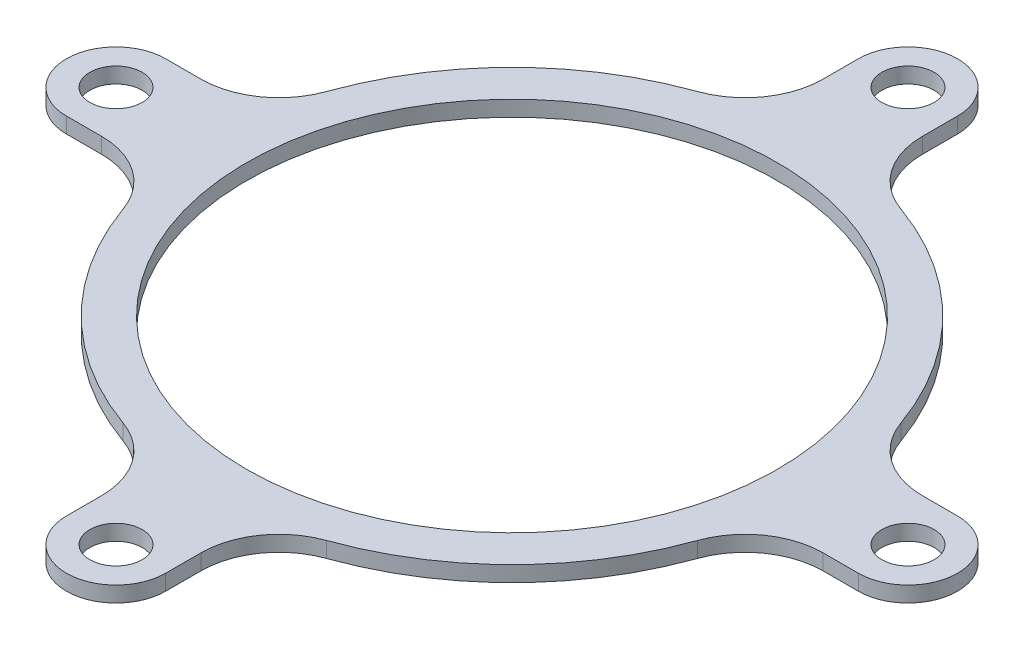
ISO-10303-21;
HEADER;
FILE_DESCRIPTION(('STEP AP214'),'2;1');
FILE_NAME('part.step','',(''),(''),'','','');
FILE_SCHEMA(('AUTOMOTIVE_DESIGN { 1 0 10303 214 1 1 1 1 }'));
ENDSEC;
DATA;
#1=APPLICATION_CONTEXT('core data for automotive mechanical design processes');
#2=APPLICATION_PROTOCOL_DEFINITION('international standard','automotive_design',2000,#1);
#3=PRODUCT_CONTEXT('',#1,'mechanical');
#4=PRODUCT('Part','Part','',(#3));
#5=PRODUCT_RELATED_PRODUCT_CATEGORY('part','',(#4));
#6=PRODUCT_DEFINITION_FORMATION('','',#4);
#7=PRODUCT_DEFINITION_CONTEXT('part definition',#1,'design');
#8=PRODUCT_DEFINITION('design','',#6,#7);
#9=PRODUCT_DEFINITION_SHAPE('','',#8);
#10=(LENGTH_UNIT() NAMED_UNIT(*) SI_UNIT(.MILLI.,.METRE.));
#11=(NAMED_UNIT(*) PLANE_ANGLE_UNIT() SI_UNIT($,.RADIAN.));
#12=(NAMED_UNIT(*) SI_UNIT($,.STERADIAN.) SOLID_ANGLE_UNIT());
#13=UNCERTAINTY_MEASURE_WITH_UNIT(LENGTH_MEASURE(1.E-05),#10,'distance_accuracy_value','');
#14=(GEOMETRIC_REPRESENTATION_CONTEXT(3) GLOBAL_UNCERTAINTY_ASSIGNED_CONTEXT((#13)) GLOBAL_UNIT_ASSIGNED_CONTEXT((#10,
#11,#12)) REPRESENTATION_CONTEXT('',''));
#15=CARTESIAN_POINT('',(0.,0.,0.));
#16=DIRECTION('',(0.,0.,1.));
#17=DIRECTION('',(1.,0.,0.));
#18=AXIS2_PLACEMENT_3D('',#15,#16,#17);
#19=CARTESIAN_POINT('',(0.,1.,0.));
#20=DIRECTION('',(0.,-1.,0.));
#21=DIRECTION('',(0.,0.,-1.));
#22=AXIS2_PLACEMENT_3D('',#19,#20,#21);
#23=CYLINDRICAL_SURFACE('',#22,39.);
#24=DIRECTION('',(0.,1.,0.));
#25=VECTOR('',#24,1.);
#26=CARTESIAN_POINT('',(36.7648599354392,-33.9979878651558,-13.0132653061228));
#27=LINE('',#26,#25);
#28=CARTESIAN_POINT('',(36.7648599354392,-1.,-13.0132653061228));
#29=VERTEX_POINT('',#28);
#30=CARTESIAN_POINT('',(36.7648599354392,1.,-13.0132653061228));
#31=VERTEX_POINT('',#30);
#32=EDGE_CURVE('E236',#29,#31,#27,.T.);
#33=ORIENTED_EDGE('',*,*,#32,.F.);
#34=CARTESIAN_POINT('',(0.,-1.,0.));
#35=DIRECTION('',(0.,1.,0.));
#36=DIRECTION('',(0.,0.,1.));
#37=AXIS2_PLACEMENT_3D('',#34,#35,#36);
#38=CIRCLE('',#37,39.);
#39=CARTESIAN_POINT('',(13.0132653061225,-1.,-36.7648599354393));
#40=VERTEX_POINT('',#39);
#41=EDGE_CURVE('E386',#29,#40,#38,.T.);
#42=ORIENTED_EDGE('',*,*,#41,.T.);
#43=DIRECTION('',(0.,1.,0.));
#44=VECTOR('',#43,1.);
#45=CARTESIAN_POINT('',(13.0132653061225,-33.9979878651557,-36.7648599354393));
#46=LINE('',#45,#44);
#47=CARTESIAN_POINT('',(13.0132653061225,1.,-36.7648599354393));
#48=VERTEX_POINT('',#47);
#49=EDGE_CURVE('E376',#40,#48,#46,.T.);
#50=ORIENTED_EDGE('',*,*,#49,.T.);
#51=CARTESIAN_POINT('',(0.,1.,0.));
#52=DIRECTION('',(0.,1.,0.));
#53=DIRECTION('',(0.,0.,1.));
#54=AXIS2_PLACEMENT_3D('',#51,#52,#53);
#55=CIRCLE('',#54,39.);
#56=EDGE_CURVE('E47',#31,#48,#55,.T.);
#57=ORIENTED_EDGE('',*,*,#56,.F.);
#58=EDGE_LOOP('',(#33,#42,#50,#57));
#59=FACE_BOUND('',#58,.T.);
#60=ADVANCED_FACE('F37',(#59),#23,.T.);
#61=CARTESIAN_POINT('',(13.0132653061224,-1.,36.7648599354393));
#62=VERTEX_POINT('',#61);
#63=CARTESIAN_POINT('',(36.7648599354394,-1.,13.0132653061221));
#64=VERTEX_POINT('',#63);
#65=EDGE_CURVE('E444',#62,#64,#38,.T.);
#66=ORIENTED_EDGE('',*,*,#65,.T.);
#67=DIRECTION('',(0.,1.,0.));
#68=VECTOR('',#67,1.);
#69=CARTESIAN_POINT('',(36.7648599354394,-33.9979878651558,13.0132653061221));
#70=LINE('',#69,#68);
#71=CARTESIAN_POINT('',(36.7648599354394,1.,13.0132653061221));
#72=VERTEX_POINT('',#71);
#73=EDGE_CURVE('E61',#64,#72,#70,.T.);
#74=ORIENTED_EDGE('',*,*,#73,.T.);
#75=CARTESIAN_POINT('',(13.0132653061225,1.,36.7648599354393));
#76=VERTEX_POINT('',#75);
#77=EDGE_CURVE('E224',#76,#72,#55,.T.);
#78=ORIENTED_EDGE('',*,*,#77,.F.);
#79=DIRECTION('',(0.,1.,0.));
#80=VECTOR('',#79,1.);
#81=CARTESIAN_POINT('',(13.0132653061224,-33.9979878651557,36.7648599354393));
#82=LINE('',#81,#80);
#83=EDGE_CURVE('E278',#62,#76,#82,.T.);
#84=ORIENTED_EDGE('',*,*,#83,.F.);
#85=EDGE_LOOP('',(#66,#74,#78,#84));
#86=FACE_BOUND('',#85,.T.);
#87=ADVANCED_FACE('F410',(#86),#23,.T.);
#88=CARTESIAN_POINT('',(-36.7648599354393,-1.,13.0132653061226));
#89=VERTEX_POINT('',#88);
#90=CARTESIAN_POINT('',(-13.0132653061225,-1.,36.7648599354393));
#91=VERTEX_POINT('',#90);
#92=EDGE_CURVE('E440',#89,#91,#38,.T.);
#93=ORIENTED_EDGE('',*,*,#92,.T.);
#94=DIRECTION('',(0.,1.,0.));
#95=VECTOR('',#94,1.);
#96=CARTESIAN_POINT('',(-13.0132653061225,-33.9979878651557,36.7648599354393));
#97=LINE('',#96,#95);
#98=CARTESIAN_POINT('',(-13.0132653061225,1.,36.7648599354393));
#99=VERTEX_POINT('',#98);
#100=EDGE_CURVE('E286',#91,#99,#97,.T.);
#101=ORIENTED_EDGE('',*,*,#100,.T.);
#102=CARTESIAN_POINT('',(-36.7648599354393,1.,13.0132653061226));
#103=VERTEX_POINT('',#102);
#104=EDGE_CURVE('E46',#103,#99,#55,.T.);
#105=ORIENTED_EDGE('',*,*,#104,.F.);
#106=DIRECTION('',(0.,1.,0.));
#107=VECTOR('',#106,1.);
#108=CARTESIAN_POINT('',(-36.7648599354392,-33.9979878651558,13.0132653061226));
#109=LINE('',#108,#107);
#110=EDGE_CURVE('E323',#89,#103,#109,.T.);
#111=ORIENTED_EDGE('',*,*,#110,.F.);
#112=EDGE_LOOP('',(#93,#101,#105,#111));
#113=FACE_BOUND('',#112,.T.);
#114=ADVANCED_FACE('F406',(#113),#23,.T.);
#115=CARTESIAN_POINT('',(0.,1.,0.));
#116=DIRECTION('',(0.,1.,0.));
#117=DIRECTION('',(0.,0.,1.));
#118=AXIS2_PLACEMENT_3D('',#115,#116,#117);
#119=PLANE('',#118);
#120=CARTESIAN_POINT('',(-13.0132653061225,1.,-36.7648599354393));
#121=VERTEX_POINT('',#120);
#122=CARTESIAN_POINT('',(-36.7648599354393,1.,-13.0132653061223));
#123=VERTEX_POINT('',#122);
#124=EDGE_CURVE('E11',#121,#123,#55,.T.);
#125=ORIENTED_EDGE('',*,*,#124,.T.);
#126=CARTESIAN_POINT('',(-46.1917470983725,1.,-16.3499999999998));
#127=DIRECTION('',(0.,-1.,0.));
#128=DIRECTION('',(1.,0.,0.));
#129=AXIS2_PLACEMENT_3D('',#126,#127,#128);
#130=CIRCLE('',#129,10.);
#131=CARTESIAN_POINT('',(-46.1917470983725,1.,-6.34999999999984));
#132=VERTEX_POINT('',#131);
#133=EDGE_CURVE('E311',#123,#132,#130,.T.);
#134=ORIENTED_EDGE('',*,*,#133,.T.);
#135=DIRECTION('',(-1.,0.,0.));
#136=VECTOR('',#135,1.);
#137=CARTESIAN_POINT('',(-50.7,1.,-6.34999999999982));
#138=LINE('',#137,#136);
#139=CARTESIAN_POINT('',(-50.7,1.,-6.34999999999982));
#140=VERTEX_POINT('',#139);
#141=EDGE_CURVE('E314',#132,#140,#138,.T.);
#142=ORIENTED_EDGE('',*,*,#141,.T.);
#143=CARTESIAN_POINT('',(-50.7,1.,1.77018103879347E-13));
#144=DIRECTION('',(0.,1.,0.));
#145=DIRECTION('',(-1.,0.,0.));
#146=AXIS2_PLACEMENT_3D('',#143,#144,#145);
#147=CIRCLE('',#146,6.35);
#148=CARTESIAN_POINT('',(-50.7,1.,6.35000000000018));
#149=VERTEX_POINT('',#148);
#150=EDGE_CURVE('E317',#140,#149,#147,.T.);
#151=ORIENTED_EDGE('',*,*,#150,.T.);
#152=DIRECTION('',(1.,0.,0.));
#153=VECTOR('',#152,1.);
#154=CARTESIAN_POINT('',(-46.1917470983724,1.,6.35000000000016));
#155=LINE('',#154,#153);
#156=CARTESIAN_POINT('',(-46.1917470983724,1.,6.35000000000016));
#157=VERTEX_POINT('',#156);
#158=EDGE_CURVE('E320',#149,#157,#155,.T.);
#159=ORIENTED_EDGE('',*,*,#158,.T.);
#160=CARTESIAN_POINT('',(-46.1917470983724,1.,16.3500000000002));
#161=DIRECTION('',(0.,-1.,0.));
#162=DIRECTION('',(-1.,0.,0.));
#163=AXIS2_PLACEMENT_3D('',#160,#161,#162);
#164=CIRCLE('',#163,10.);
#165=EDGE_CURVE('E308',#157,#103,#164,.T.);
#166=ORIENTED_EDGE('',*,*,#165,.T.);
#167=ORIENTED_EDGE('',*,*,#104,.T.);
#168=CARTESIAN_POINT('',(-16.35,1.,46.1917470983725));
#169=DIRECTION('',(0.,-1.,0.));
#170=DIRECTION('',(0.,0.,-1.));
#171=AXIS2_PLACEMENT_3D('',#168,#169,#170);
#172=CIRCLE('',#171,10.);
#173=CARTESIAN_POINT('',(-6.35,1.,46.1917470983725));
#174=VERTEX_POINT('',#173);
#175=EDGE_CURVE('E266',#99,#174,#172,.T.);
#176=ORIENTED_EDGE('',*,*,#175,.T.);
#177=DIRECTION('',(0.,0.,1.));
#178=VECTOR('',#177,1.);
#179=CARTESIAN_POINT('',(-6.35,1.,50.7));
#180=LINE('',#179,#178);
#181=CARTESIAN_POINT('',(-6.35,1.,50.7));
#182=VERTEX_POINT('',#181);
#183=EDGE_CURVE('E269',#174,#182,#180,.T.);
#184=ORIENTED_EDGE('',*,*,#183,.T.);
#185=CARTESIAN_POINT('',(0.,1.,50.7));
#186=DIRECTION('',(0.,1.,0.));
#187=DIRECTION('',(0.,0.,1.));
#188=AXIS2_PLACEMENT_3D('',#185,#186,#187);
#189=CIRCLE('',#188,6.35);
#190=CARTESIAN_POINT('',(6.35,1.,50.7));
#191=VERTEX_POINT('',#190);
#192=EDGE_CURVE('E272',#182,#191,#189,.T.);
#193=ORIENTED_EDGE('',*,*,#192,.T.);
#194=DIRECTION('',(0.,0.,-1.));
#195=VECTOR('',#194,1.);
#196=CARTESIAN_POINT('',(6.35,1.,46.1917470983725));
#197=LINE('',#196,#195);
#198=CARTESIAN_POINT('',(6.35,1.,46.1917470983725));
#199=VERTEX_POINT('',#198);
#200=EDGE_CURVE('E275',#191,#199,#197,.T.);
#201=ORIENTED_EDGE('',*,*,#200,.T.);
#202=CARTESIAN_POINT('',(16.35,1.,46.1917470983725));
#203=DIRECTION('',(0.,-1.,0.));
#204=DIRECTION('',(0.,0.,1.));
#205=AXIS2_PLACEMENT_3D('',#202,#203,#204);
#206=CIRCLE('',#205,10.);
#207=EDGE_CURVE('E264',#199,#76,#206,.T.);
#208=ORIENTED_EDGE('',*,*,#207,.T.);
#209=ORIENTED_EDGE('',*,*,#77,.T.);
#210=CARTESIAN_POINT('',(46.1917470983726,1.,16.3499999999995));
#211=DIRECTION('',(0.,-1.,0.));
#212=DIRECTION('',(-1.,0.,0.));
#213=AXIS2_PLACEMENT_3D('',#210,#211,#212);
#214=CIRCLE('',#213,10.);
#215=CARTESIAN_POINT('',(46.1917470983725,1.,6.34999999999952));
#216=VERTEX_POINT('',#215);
#217=EDGE_CURVE('E205',#72,#216,#214,.T.);
#218=ORIENTED_EDGE('',*,*,#217,.T.);
#219=DIRECTION('',(1.,0.,0.));
#220=VECTOR('',#219,1.);
#221=CARTESIAN_POINT('',(50.7000000000001,1.,6.34999999999947));
#222=LINE('',#221,#220);
#223=CARTESIAN_POINT('',(50.7000000000001,1.,6.34999999999947));
#224=VERTEX_POINT('',#223);
#225=EDGE_CURVE('E213',#216,#224,#222,.T.);
#226=ORIENTED_EDGE('',*,*,#225,.T.);
#227=CARTESIAN_POINT('',(50.7,1.,-5.31054311638041E-13));
#228=DIRECTION('',(0.,1.,0.));
#229=DIRECTION('',(1.,0.,0.));
#230=AXIS2_PLACEMENT_3D('',#227,#228,#229);
#231=CIRCLE('',#230,6.35);
#232=CARTESIAN_POINT('',(50.6999999999999,1.,-6.35000000000053));
#233=VERTEX_POINT('',#232);
#234=EDGE_CURVE('E219',#224,#233,#231,.T.);
#235=ORIENTED_EDGE('',*,*,#234,.T.);
#236=DIRECTION('',(-1.,0.,0.));
#237=VECTOR('',#236,1.);
#238=CARTESIAN_POINT('',(46.1917470983724,1.,-6.35000000000048));
#239=LINE('',#238,#237);
#240=CARTESIAN_POINT('',(46.1917470983724,1.,-6.35000000000048));
#241=VERTEX_POINT('',#240);
#242=EDGE_CURVE('E233',#233,#241,#239,.T.);
#243=ORIENTED_EDGE('',*,*,#242,.T.);
#244=CARTESIAN_POINT('',(46.1917470983723,1.,-16.3500000000005));
#245=DIRECTION('',(0.,-1.,0.));
#246=DIRECTION('',(1.,0.,0.));
#247=AXIS2_PLACEMENT_3D('',#244,#245,#246);
#248=CIRCLE('',#247,10.);
#249=EDGE_CURVE('E225',#241,#31,#248,.T.);
#250=ORIENTED_EDGE('',*,*,#249,.T.);
#251=ORIENTED_EDGE('',*,*,#56,.T.);
#252=CARTESIAN_POINT('',(16.35,1.,-46.1917470983725));
#253=DIRECTION('',(0.,-1.,0.));
#254=DIRECTION('',(0.,0.,1.));
#255=AXIS2_PLACEMENT_3D('',#252,#253,#254);
#256=CIRCLE('',#255,10.);
#257=CARTESIAN_POINT('',(6.35,1.,-46.1917470983725));
#258=VERTEX_POINT('',#257);
#259=EDGE_CURVE('E356',#48,#258,#256,.T.);
#260=ORIENTED_EDGE('',*,*,#259,.T.);
#261=DIRECTION('',(0.,0.,-1.));
#262=VECTOR('',#261,1.);
#263=CARTESIAN_POINT('',(6.35,1.,-50.7));
#264=LINE('',#263,#262);
#265=CARTESIAN_POINT('',(6.35,1.,-50.7));
#266=VERTEX_POINT('',#265);
#267=EDGE_CURVE('E359',#258,#266,#264,.T.);
#268=ORIENTED_EDGE('',*,*,#267,.T.);
#269=CARTESIAN_POINT('',(0.,1.,-50.7));
#270=DIRECTION('',(0.,1.,0.));
#271=DIRECTION('',(0.,0.,-1.));
#272=AXIS2_PLACEMENT_3D('',#269,#270,#271);
#273=CIRCLE('',#272,6.35);
#274=CARTESIAN_POINT('',(-6.35,1.,-50.7));
#275=VERTEX_POINT('',#274);
#276=EDGE_CURVE('E362',#266,#275,#273,.T.);
#277=ORIENTED_EDGE('',*,*,#276,.T.);
#278=DIRECTION('',(0.,0.,1.));
#279=VECTOR('',#278,1.);
#280=CARTESIAN_POINT('',(-6.35,1.,-46.1917470983725));
#281=LINE('',#280,#279);
#282=CARTESIAN_POINT('',(-6.35,1.,-46.1917470983725));
#283=VERTEX_POINT('',#282);
#284=EDGE_CURVE('E365',#275,#283,#281,.T.);
#285=ORIENTED_EDGE('',*,*,#284,.T.);
#286=CARTESIAN_POINT('',(-16.35,1.,-46.1917470983725));
#287=DIRECTION('',(0.,-1.,0.));
#288=DIRECTION('',(0.,0.,-1.));
#289=AXIS2_PLACEMENT_3D('',#286,#287,#288);
#290=CIRCLE('',#289,10.);
#291=EDGE_CURVE('E353',#283,#121,#290,.T.);
#292=ORIENTED_EDGE('',*,*,#291,.T.);
#293=EDGE_LOOP('',(#125,#134,#142,#151,#159,#166,#167,#176,#184,#193,#201,#208,#209,#218,#226,
#235,#243,#250,#251,#260,#268,#277,#285,#292));
#294=FACE_BOUND('',#293,.T.);
#295=CARTESIAN_POINT('',(0.,1.,0.));
#296=DIRECTION('',(0.,1.,0.));
#297=DIRECTION('',(0.,0.,1.));
#298=AXIS2_PLACEMENT_3D('',#295,#296,#297);
#299=CIRCLE('',#298,34.);
#300=CARTESIAN_POINT('',(0.,1.,34.));
#301=VERTEX_POINT('',#300);
#302=EDGE_CURVE('E383',#301,#301,#299,.T.);
#303=ORIENTED_EDGE('',*,*,#302,.F.);
#304=EDGE_LOOP('',(#303));
#305=FACE_BOUND('',#304,.T.);
#306=CARTESIAN_POINT('',(0.,1.,-50.7));
#307=DIRECTION('',(0.,1.,0.));
#308=DIRECTION('',(0.,0.,1.));
#309=AXIS2_PLACEMENT_3D('',#306,#307,#308);
#310=CIRCLE('',#309,3.35);
#311=CARTESIAN_POINT('',(0.,1.,-47.35));
#312=VERTEX_POINT('',#311);
#313=EDGE_CURVE('E337',#312,#312,#310,.T.);
#314=ORIENTED_EDGE('',*,*,#313,.F.);
#315=EDGE_LOOP('',(#314));
#316=FACE_BOUND('',#315,.T.);
#317=CARTESIAN_POINT('',(-50.7,1.,1.77018103879347E-13));
#318=DIRECTION('',(0.,1.,0.));
#319=DIRECTION('',(1.,0.,0.));
#320=AXIS2_PLACEMENT_3D('',#317,#318,#319);
#321=CIRCLE('',#320,3.35);
#322=CARTESIAN_POINT('',(-47.35,1.,1.65321641394222E-13));
#323=VERTEX_POINT('',#322);
#324=EDGE_CURVE('E292',#323,#323,#321,.T.);
#325=ORIENTED_EDGE('',*,*,#324,.F.);
#326=EDGE_LOOP('',(#325));
#327=FACE_BOUND('',#326,.T.);
#328=CARTESIAN_POINT('',(0.,1.,50.7));
#329=DIRECTION('',(0.,1.,0.));
#330=DIRECTION('',(0.,0.,-1.));
#331=AXIS2_PLACEMENT_3D('',#328,#329,#330);
#332=CIRCLE('',#331,3.35);
#333=CARTESIAN_POINT('',(0.,1.,47.35));
#334=VERTEX_POINT('',#333);
#335=EDGE_CURVE('E247',#334,#334,#332,.T.);
#336=ORIENTED_EDGE('',*,*,#335,.F.);
#337=EDGE_LOOP('',(#336));
#338=FACE_BOUND('',#337,.T.);
#339=CARTESIAN_POINT('',(50.7,1.,-5.31054311638041E-13));
#340=DIRECTION('',(0.,1.,0.));
#341=DIRECTION('',(-1.,0.,0.));
#342=AXIS2_PLACEMENT_3D('',#339,#340,#341);
#343=CIRCLE('',#342,3.35);
#344=CARTESIAN_POINT('',(47.35,1.,-4.95964924182667E-13));
#345=VERTEX_POINT('',#344);
#346=EDGE_CURVE('E228',#345,#345,#343,.T.);
#347=ORIENTED_EDGE('',*,*,#346,.F.);
#348=EDGE_LOOP('',(#347));
#349=FACE_BOUND('',#348,.T.);
#350=ADVANCED_FACE('F221',(#294,#305,#316,#327,#338,#349),#119,.T.);
#351=CARTESIAN_POINT('',(0.,-1.,0.));
#352=DIRECTION('',(0.,1.,0.));
#353=DIRECTION('',(0.,0.,1.));
#354=AXIS2_PLACEMENT_3D('',#351,#352,#353);
#355=PLANE('',#354);
#356=CARTESIAN_POINT('',(-13.0132653061224,-1.,-36.7648599354393));
#357=VERTEX_POINT('',#356);
#358=CARTESIAN_POINT('',(-36.7648599354393,-1.,-13.0132653061223));
#359=VERTEX_POINT('',#358);
#360=EDGE_CURVE('E41',#357,#359,#38,.T.);
#361=ORIENTED_EDGE('',*,*,#360,.F.);
#362=CARTESIAN_POINT('',(-16.35,-1.,-46.1917470983725));
#363=DIRECTION('',(0.,1.,0.));
#364=DIRECTION('',(0.,0.,1.));
#365=AXIS2_PLACEMENT_3D('',#362,#363,#364);
#366=CIRCLE('',#365,10.);
#367=CARTESIAN_POINT('',(-6.35,-1.,-46.1917470983725));
#368=VERTEX_POINT('',#367);
#369=EDGE_CURVE('E348',#357,#368,#366,.T.);
#370=ORIENTED_EDGE('',*,*,#369,.T.);
#371=DIRECTION('',(0.,0.,-1.));
#372=VECTOR('',#371,1.);
#373=CARTESIAN_POINT('',(-6.35,-1.,-46.1917470983725));
#374=LINE('',#373,#372);
#375=CARTESIAN_POINT('',(-6.35,-1.,-50.7));
#376=VERTEX_POINT('',#375);
#377=EDGE_CURVE('E346',#368,#376,#374,.T.);
#378=ORIENTED_EDGE('',*,*,#377,.T.);
#379=CARTESIAN_POINT('',(0.,-1.,-50.7));
#380=DIRECTION('',(0.,1.,0.));
#381=DIRECTION('',(0.,0.,1.));
#382=AXIS2_PLACEMENT_3D('',#379,#380,#381);
#383=CIRCLE('',#382,6.35);
#384=CARTESIAN_POINT('',(6.35,-1.,-50.7));
#385=VERTEX_POINT('',#384);
#386=EDGE_CURVE('E344',#376,#385,#383,.F.);
#387=ORIENTED_EDGE('',*,*,#386,.T.);
#388=DIRECTION('',(0.,0.,1.));
#389=VECTOR('',#388,1.);
#390=CARTESIAN_POINT('',(6.35,-1.,-50.7));
#391=LINE('',#390,#389);
#392=CARTESIAN_POINT('',(6.35,-1.,-46.1917470983725));
#393=VERTEX_POINT('',#392);
#394=EDGE_CURVE('E341',#385,#393,#391,.T.);
#395=ORIENTED_EDGE('',*,*,#394,.T.);
#396=CARTESIAN_POINT('',(16.35,-1.,-46.1917470983725));
#397=DIRECTION('',(0.,1.,0.));
#398=DIRECTION('',(0.,0.,1.));
#399=AXIS2_PLACEMENT_3D('',#396,#397,#398);
#400=CIRCLE('',#399,10.);
#401=EDGE_CURVE('E338',#393,#40,#400,.T.);
#402=ORIENTED_EDGE('',*,*,#401,.T.);
#403=ORIENTED_EDGE('',*,*,#41,.F.);
#404=CARTESIAN_POINT('',(46.1917470983723,-1.,-16.3500000000005));
#405=DIRECTION('',(0.,1.,0.));
#406=DIRECTION('',(0.,0.,1.));
#407=AXIS2_PLACEMENT_3D('',#404,#405,#406);
#408=CIRCLE('',#407,10.);
#409=CARTESIAN_POINT('',(46.1917470983724,-1.,-6.35000000000048));
#410=VERTEX_POINT('',#409);
#411=EDGE_CURVE('E248',#29,#410,#408,.T.);
#412=ORIENTED_EDGE('',*,*,#411,.T.);
#413=DIRECTION('',(1.,0.,0.));
#414=VECTOR('',#413,1.);
#415=CARTESIAN_POINT('',(46.1917470983724,-1.,-6.35000000000048));
#416=LINE('',#415,#414);
#417=CARTESIAN_POINT('',(50.6999999999999,-1.,-6.35000000000053));
#418=VERTEX_POINT('',#417);
#419=EDGE_CURVE('E421',#410,#418,#416,.T.);
#420=ORIENTED_EDGE('',*,*,#419,.T.);
#421=CARTESIAN_POINT('',(50.7,-1.,-5.31054311638041E-13));
#422=DIRECTION('',(0.,1.,0.));
#423=DIRECTION('',(0.,0.,1.));
#424=AXIS2_PLACEMENT_3D('',#421,#422,#423);
#425=CIRCLE('',#424,6.35);
#426=CARTESIAN_POINT('',(50.7000000000001,-1.,6.34999999999947));
#427=VERTEX_POINT('',#426);
#428=EDGE_CURVE('E423',#418,#427,#425,.F.);
#429=ORIENTED_EDGE('',*,*,#428,.T.);
#430=DIRECTION('',(-1.,0.,0.));
#431=VECTOR('',#430,1.);
#432=CARTESIAN_POINT('',(50.7000000000001,-1.,6.34999999999947));
#433=LINE('',#432,#431);
#434=CARTESIAN_POINT('',(46.1917470983725,-1.,6.34999999999952));
#435=VERTEX_POINT('',#434);
#436=EDGE_CURVE('E456',#427,#435,#433,.T.);
#437=ORIENTED_EDGE('',*,*,#436,.T.);
#438=CARTESIAN_POINT('',(46.1917470983726,-1.,16.3499999999995));
#439=DIRECTION('',(0.,1.,0.));
#440=DIRECTION('',(0.,0.,1.));
#441=AXIS2_PLACEMENT_3D('',#438,#439,#440);
#442=CIRCLE('',#441,10.);
#443=EDGE_CURVE('E207',#435,#64,#442,.T.);
#444=ORIENTED_EDGE('',*,*,#443,.T.);
#445=ORIENTED_EDGE('',*,*,#65,.F.);
#446=CARTESIAN_POINT('',(16.35,-1.,46.1917470983725));
#447=DIRECTION('',(0.,1.,0.));
#448=DIRECTION('',(0.,0.,1.));
#449=AXIS2_PLACEMENT_3D('',#446,#447,#448);
#450=CIRCLE('',#449,10.);
#451=CARTESIAN_POINT('',(6.35,-1.,46.1917470983725));
#452=VERTEX_POINT('',#451);
#453=EDGE_CURVE('E259',#62,#452,#450,.T.);
#454=ORIENTED_EDGE('',*,*,#453,.T.);
#455=DIRECTION('',(0.,0.,1.));
#456=VECTOR('',#455,1.);
#457=CARTESIAN_POINT('',(6.35,-1.,46.1917470983725));
#458=LINE('',#457,#456);
#459=CARTESIAN_POINT('',(6.35,-1.,50.7));
#460=VERTEX_POINT('',#459);
#461=EDGE_CURVE('E257',#452,#460,#458,.T.);
#462=ORIENTED_EDGE('',*,*,#461,.T.);
#463=CARTESIAN_POINT('',(0.,-1.,50.7));
#464=DIRECTION('',(0.,1.,0.));
#465=DIRECTION('',(0.,0.,1.));
#466=AXIS2_PLACEMENT_3D('',#463,#464,#465);
#467=CIRCLE('',#466,6.35);
#468=CARTESIAN_POINT('',(-6.35,-1.,50.7));
#469=VERTEX_POINT('',#468);
#470=EDGE_CURVE('E255',#460,#469,#467,.F.);
#471=ORIENTED_EDGE('',*,*,#470,.T.);
#472=DIRECTION('',(0.,0.,-1.));
#473=VECTOR('',#472,1.);
#474=CARTESIAN_POINT('',(-6.35,-1.,50.7));
#475=LINE('',#474,#473);
#476=CARTESIAN_POINT('',(-6.35,-1.,46.1917470983725));
#477=VERTEX_POINT('',#476);
#478=EDGE_CURVE('E252',#469,#477,#475,.T.);
#479=ORIENTED_EDGE('',*,*,#478,.T.);
#480=CARTESIAN_POINT('',(-16.35,-1.,46.1917470983725));
#481=DIRECTION('',(0.,1.,0.));
#482=DIRECTION('',(0.,0.,1.));
#483=AXIS2_PLACEMENT_3D('',#480,#481,#482);
#484=CIRCLE('',#483,10.);
#485=EDGE_CURVE('E249',#477,#91,#484,.T.);
#486=ORIENTED_EDGE('',*,*,#485,.T.);
#487=ORIENTED_EDGE('',*,*,#92,.F.);
#488=CARTESIAN_POINT('',(-46.1917470983724,-1.,16.3500000000002));
#489=DIRECTION('',(0.,1.,0.));
#490=DIRECTION('',(0.,0.,1.));
#491=AXIS2_PLACEMENT_3D('',#488,#489,#490);
#492=CIRCLE('',#491,10.);
#493=CARTESIAN_POINT('',(-46.1917470983724,-1.,6.35000000000016));
#494=VERTEX_POINT('',#493);
#495=EDGE_CURVE('E303',#89,#494,#492,.T.);
#496=ORIENTED_EDGE('',*,*,#495,.T.);
#497=DIRECTION('',(-1.,0.,0.));
#498=VECTOR('',#497,1.);
#499=CARTESIAN_POINT('',(-46.1917470983724,-1.,6.35000000000016));
#500=LINE('',#499,#498);
#501=CARTESIAN_POINT('',(-50.7,-1.,6.35000000000018));
#502=VERTEX_POINT('',#501);
#503=EDGE_CURVE('E301',#494,#502,#500,.T.);
#504=ORIENTED_EDGE('',*,*,#503,.T.);
#505=CARTESIAN_POINT('',(-50.7,-1.,1.77018103879347E-13));
#506=DIRECTION('',(0.,1.,0.));
#507=DIRECTION('',(0.,0.,1.));
#508=AXIS2_PLACEMENT_3D('',#505,#506,#507);
#509=CIRCLE('',#508,6.35);
#510=CARTESIAN_POINT('',(-50.7,-1.,-6.34999999999982));
#511=VERTEX_POINT('',#510);
#512=EDGE_CURVE('E299',#502,#511,#509,.F.);
#513=ORIENTED_EDGE('',*,*,#512,.T.);
#514=DIRECTION('',(1.,0.,0.));
#515=VECTOR('',#514,1.);
#516=CARTESIAN_POINT('',(-50.7,-1.,-6.34999999999982));
#517=LINE('',#516,#515);
#518=CARTESIAN_POINT('',(-46.1917470983725,-1.,-6.34999999999984));
#519=VERTEX_POINT('',#518);
#520=EDGE_CURVE('E296',#511,#519,#517,.T.);
#521=ORIENTED_EDGE('',*,*,#520,.T.);
#522=CARTESIAN_POINT('',(-46.1917470983725,-1.,-16.3499999999998));
#523=DIRECTION('',(0.,1.,0.));
#524=DIRECTION('',(0.,0.,1.));
#525=AXIS2_PLACEMENT_3D('',#522,#523,#524);
#526=CIRCLE('',#525,10.);
#527=EDGE_CURVE('E293',#519,#359,#526,.T.);
#528=ORIENTED_EDGE('',*,*,#527,.T.);
#529=EDGE_LOOP('',(#361,#370,#378,#387,#395,#402,#403,#412,#420,#429,#437,#444,#445,#454,#462,
#471,#479,#486,#487,#496,#504,#513,#521,#528));
#530=FACE_BOUND('',#529,.T.);
#531=CARTESIAN_POINT('',(0.,-1.,0.));
#532=DIRECTION('',(0.,1.,0.));
#533=DIRECTION('',(0.,0.,1.));
#534=AXIS2_PLACEMENT_3D('',#531,#532,#533);
#535=CIRCLE('',#534,34.);
#536=CARTESIAN_POINT('',(0.,-1.,34.));
#537=VERTEX_POINT('',#536);
#538=EDGE_CURVE('E382',#537,#537,#535,.T.);
#539=ORIENTED_EDGE('',*,*,#538,.T.);
#540=EDGE_LOOP('',(#539));
#541=FACE_BOUND('',#540,.T.);
#542=CARTESIAN_POINT('',(0.,-1.,-50.7));
#543=DIRECTION('',(0.,1.,0.));
#544=DIRECTION('',(0.,0.,1.));
#545=AXIS2_PLACEMENT_3D('',#542,#543,#544);
#546=CIRCLE('',#545,3.35);
#547=CARTESIAN_POINT('',(0.,-1.,-47.35));
#548=VERTEX_POINT('',#547);
#549=EDGE_CURVE('E350',#548,#548,#546,.F.);
#550=ORIENTED_EDGE('',*,*,#549,.F.);
#551=EDGE_LOOP('',(#550));
#552=FACE_BOUND('',#551,.T.);
#553=CARTESIAN_POINT('',(-50.7,-1.,1.77018103879347E-13));
#554=DIRECTION('',(0.,1.,0.));
#555=DIRECTION('',(0.,0.,1.));
#556=AXIS2_PLACEMENT_3D('',#553,#554,#555);
#557=CIRCLE('',#556,3.35);
#558=CARTESIAN_POINT('',(-50.7,-1.,3.35000000000018));
#559=VERTEX_POINT('',#558);
#560=EDGE_CURVE('E305',#559,#559,#557,.F.);
#561=ORIENTED_EDGE('',*,*,#560,.F.);
#562=EDGE_LOOP('',(#561));
#563=FACE_BOUND('',#562,.T.);
#564=CARTESIAN_POINT('',(0.,-1.,50.7));
#565=DIRECTION('',(0.,1.,0.));
#566=DIRECTION('',(0.,0.,1.));
#567=AXIS2_PLACEMENT_3D('',#564,#565,#566);
#568=CIRCLE('',#567,3.35);
#569=CARTESIAN_POINT('',(0.,-1.,54.05));
#570=VERTEX_POINT('',#569);
#571=EDGE_CURVE('E261',#570,#570,#568,.F.);
#572=ORIENTED_EDGE('',*,*,#571,.F.);
#573=EDGE_LOOP('',(#572));
#574=FACE_BOUND('',#573,.T.);
#575=CARTESIAN_POINT('',(50.7,-1.,-5.31054311638041E-13));
#576=DIRECTION('',(0.,1.,0.));
#577=DIRECTION('',(0.,0.,1.));
#578=AXIS2_PLACEMENT_3D('',#575,#576,#577);
#579=CIRCLE('',#578,3.35);
#580=CARTESIAN_POINT('',(50.7,-1.,3.34999999999947));
#581=VERTEX_POINT('',#580);
#582=EDGE_CURVE('E244',#581,#581,#579,.F.);
#583=ORIENTED_EDGE('',*,*,#582,.F.);
#584=EDGE_LOOP('',(#583));
#585=FACE_BOUND('',#584,.T.);
#586=ADVANCED_FACE('F390',(#530,#541,#552,#563,#574,#585),#355,.F.);
#587=ORIENTED_EDGE('',*,*,#360,.T.);
#588=DIRECTION('',(0.,1.,0.));
#589=VECTOR('',#588,1.);
#590=CARTESIAN_POINT('',(-36.7648599354393,-33.9979878651558,-13.0132653061223));
#591=LINE('',#590,#589);
#592=EDGE_CURVE('E331',#359,#123,#591,.T.);
#593=ORIENTED_EDGE('',*,*,#592,.T.);
#594=ORIENTED_EDGE('',*,*,#124,.F.);
#595=DIRECTION('',(0.,1.,0.));
#596=VECTOR('',#595,1.);
#597=CARTESIAN_POINT('',(-13.0132653061224,-33.9979878651557,-36.7648599354393));
#598=LINE('',#597,#596);
#599=EDGE_CURVE('E368',#357,#121,#598,.T.);
#600=ORIENTED_EDGE('',*,*,#599,.F.);
#601=EDGE_LOOP('',(#587,#593,#594,#600));
#602=FACE_BOUND('',#601,.T.);
#603=ADVANCED_FACE('F39',(#602),#23,.T.);
#604=CARTESIAN_POINT('',(0.,1.,0.));
#605=DIRECTION('',(0.,-1.,0.));
#606=DIRECTION('',(0.,0.,-1.));
#607=AXIS2_PLACEMENT_3D('',#604,#605,#606);
#608=CYLINDRICAL_SURFACE('',#607,34.);
#609=ORIENTED_EDGE('',*,*,#302,.T.);
#610=EDGE_LOOP('',(#609));
#611=FACE_BOUND('',#610,.T.);
#612=ORIENTED_EDGE('',*,*,#538,.F.);
#613=EDGE_LOOP('',(#612));
#614=FACE_BOUND('',#613,.T.);
#615=ADVANCED_FACE('F393',(#611,#614),#608,.F.);
#616=CARTESIAN_POINT('',(16.35,-33.9979878651557,-46.1917470983725));
#617=DIRECTION('',(0.,1.,0.));
#618=DIRECTION('',(0.,0.,1.));
#619=AXIS2_PLACEMENT_3D('',#616,#617,#618);
#620=CYLINDRICAL_SURFACE('',#619,10.);
#621=ORIENTED_EDGE('',*,*,#401,.F.);
#622=DIRECTION('',(0.,1.,0.));
#623=VECTOR('',#622,1.);
#624=CARTESIAN_POINT('',(6.35,-33.9979878651557,-46.1917470983725));
#625=LINE('',#624,#623);
#626=EDGE_CURVE('E374',#393,#258,#625,.T.);
#627=ORIENTED_EDGE('',*,*,#626,.T.);
#628=ORIENTED_EDGE('',*,*,#259,.F.);
#629=ORIENTED_EDGE('',*,*,#49,.F.);
#630=EDGE_LOOP('',(#621,#627,#628,#629));
#631=FACE_BOUND('',#630,.T.);
#632=ADVANCED_FACE('F395',(#631),#620,.F.);
#633=CARTESIAN_POINT('',(6.35,-33.9979878651557,-50.7));
#634=DIRECTION('',(1.,0.,0.));
#635=DIRECTION('',(0.,0.,-1.));
#636=AXIS2_PLACEMENT_3D('',#633,#634,#635);
#637=PLANE('',#636);
#638=ORIENTED_EDGE('',*,*,#394,.F.);
#639=DIRECTION('',(0.,1.,0.));
#640=VECTOR('',#639,1.);
#641=CARTESIAN_POINT('',(6.35,-33.9979878651557,-50.7));
#642=LINE('',#641,#640);
#643=EDGE_CURVE('E372',#385,#266,#642,.T.);
#644=ORIENTED_EDGE('',*,*,#643,.T.);
#645=ORIENTED_EDGE('',*,*,#267,.F.);
#646=ORIENTED_EDGE('',*,*,#626,.F.);
#647=EDGE_LOOP('',(#638,#644,#645,#646));
#648=FACE_BOUND('',#647,.T.);
#649=ADVANCED_FACE('F402',(#648),#637,.T.);
#650=CARTESIAN_POINT('',(0.,-33.9979878651557,-50.7));
#651=DIRECTION('',(0.,1.,0.));
#652=DIRECTION('',(0.,0.,1.));
#653=AXIS2_PLACEMENT_3D('',#650,#651,#652);
#654=CYLINDRICAL_SURFACE('',#653,6.35);
#655=ORIENTED_EDGE('',*,*,#386,.F.);
#656=DIRECTION('',(0.,1.,0.));
#657=VECTOR('',#656,1.);
#658=CARTESIAN_POINT('',(-6.35,-33.9979878651557,-50.7));
#659=LINE('',#658,#657);
#660=EDGE_CURVE('E370',#376,#275,#659,.T.);
#661=ORIENTED_EDGE('',*,*,#660,.T.);
#662=ORIENTED_EDGE('',*,*,#276,.F.);
#663=ORIENTED_EDGE('',*,*,#643,.F.);
#664=EDGE_LOOP('',(#655,#661,#662,#663));
#665=FACE_BOUND('',#664,.T.);
#666=ADVANCED_FACE('F534',(#665),#654,.T.);
#667=CARTESIAN_POINT('',(-6.35,-33.9979878651557,-46.1917470983725));
#668=DIRECTION('',(-1.,0.,0.));
#669=DIRECTION('',(0.,0.,1.));
#670=AXIS2_PLACEMENT_3D('',#667,#668,#669);
#671=PLANE('',#670);
#672=ORIENTED_EDGE('',*,*,#377,.F.);
#673=DIRECTION('',(0.,1.,0.));
#674=VECTOR('',#673,1.);
#675=CARTESIAN_POINT('',(-6.35,-33.9979878651557,-46.1917470983725));
#676=LINE('',#675,#674);
#677=EDGE_CURVE('E342',#368,#283,#676,.T.);
#678=ORIENTED_EDGE('',*,*,#677,.T.);
#679=ORIENTED_EDGE('',*,*,#284,.F.);
#680=ORIENTED_EDGE('',*,*,#660,.F.);
#681=EDGE_LOOP('',(#672,#678,#679,#680));
#682=FACE_BOUND('',#681,.T.);
#683=ADVANCED_FACE('F531',(#682),#671,.T.);
#684=CARTESIAN_POINT('',(-16.35,-33.9979878651557,-46.1917470983725));
#685=DIRECTION('',(0.,1.,0.));
#686=DIRECTION('',(0.,0.,1.));
#687=AXIS2_PLACEMENT_3D('',#684,#685,#686);
#688=CYLINDRICAL_SURFACE('',#687,10.);
#689=ORIENTED_EDGE('',*,*,#369,.F.);
#690=ORIENTED_EDGE('',*,*,#599,.T.);
#691=ORIENTED_EDGE('',*,*,#291,.F.);
#692=ORIENTED_EDGE('',*,*,#677,.F.);
#693=EDGE_LOOP('',(#689,#690,#691,#692));
#694=FACE_BOUND('',#693,.T.);
#695=ADVANCED_FACE('F529',(#694),#688,.F.);
#696=CARTESIAN_POINT('',(0.,-33.9979878651557,-50.7));
#697=DIRECTION('',(0.,1.,0.));
#698=DIRECTION('',(0.,0.,1.));
#699=AXIS2_PLACEMENT_3D('',#696,#697,#698);
#700=CYLINDRICAL_SURFACE('',#699,3.35);
#701=ORIENTED_EDGE('',*,*,#549,.T.);
#702=EDGE_LOOP('',(#701));
#703=FACE_BOUND('',#702,.T.);
#704=ORIENTED_EDGE('',*,*,#313,.T.);
#705=EDGE_LOOP('',(#704));
#706=FACE_BOUND('',#705,.T.);
#707=ADVANCED_FACE('F522',(#703,#706),#700,.F.);
#708=CARTESIAN_POINT('',(-46.1917470983725,-33.9979878651558,-16.3499999999998));
#709=DIRECTION('',(0.,1.,0.));
#710=DIRECTION('',(0.,0.,1.));
#711=AXIS2_PLACEMENT_3D('',#708,#709,#710);
#712=CYLINDRICAL_SURFACE('',#711,10.);
#713=ORIENTED_EDGE('',*,*,#527,.F.);
#714=DIRECTION('',(0.,1.,0.));
#715=VECTOR('',#714,1.);
#716=CARTESIAN_POINT('',(-46.1917470983725,-33.9979878651558,-6.34999999999984));
#717=LINE('',#716,#715);
#718=EDGE_CURVE('E329',#519,#132,#717,.T.);
#719=ORIENTED_EDGE('',*,*,#718,.T.);
#720=ORIENTED_EDGE('',*,*,#133,.F.);
#721=ORIENTED_EDGE('',*,*,#592,.F.);
#722=EDGE_LOOP('',(#713,#719,#720,#721));
#723=FACE_BOUND('',#722,.T.);
#724=ADVANCED_FACE('F518',(#723),#712,.F.);
#725=CARTESIAN_POINT('',(-50.7,-33.9979878651558,-6.34999999999982));
#726=DIRECTION('',(0.,0.,-1.));
#727=DIRECTION('',(-1.,0.,0.));
#728=AXIS2_PLACEMENT_3D('',#725,#726,#727);
#729=PLANE('',#728);
#730=ORIENTED_EDGE('',*,*,#520,.F.);
#731=DIRECTION('',(0.,1.,0.));
#732=VECTOR('',#731,1.);
#733=CARTESIAN_POINT('',(-50.7,-33.9979878651558,-6.34999999999982));
#734=LINE('',#733,#732);
#735=EDGE_CURVE('E327',#511,#140,#734,.T.);
#736=ORIENTED_EDGE('',*,*,#735,.T.);
#737=ORIENTED_EDGE('',*,*,#141,.F.);
#738=ORIENTED_EDGE('',*,*,#718,.F.);
#739=EDGE_LOOP('',(#730,#736,#737,#738));
#740=FACE_BOUND('',#739,.T.);
#741=ADVANCED_FACE('F514',(#740),#729,.T.);
#742=CARTESIAN_POINT('',(-50.7,-33.9979878651558,1.77018103879347E-13));
#743=DIRECTION('',(0.,1.,0.));
#744=DIRECTION('',(0.,0.,1.));
#745=AXIS2_PLACEMENT_3D('',#742,#743,#744);
#746=CYLINDRICAL_SURFACE('',#745,6.35);
#747=ORIENTED_EDGE('',*,*,#512,.F.);
#748=DIRECTION('',(0.,1.,0.));
#749=VECTOR('',#748,1.);
#750=CARTESIAN_POINT('',(-50.7,-33.9979878651558,6.35000000000018));
#751=LINE('',#750,#749);
#752=EDGE_CURVE('E325',#502,#149,#751,.T.);
#753=ORIENTED_EDGE('',*,*,#752,.T.);
#754=ORIENTED_EDGE('',*,*,#150,.F.);
#755=ORIENTED_EDGE('',*,*,#735,.F.);
#756=EDGE_LOOP('',(#747,#753,#754,#755));
#757=FACE_BOUND('',#756,.T.);
#758=ADVANCED_FACE('F510',(#757),#746,.T.);
#759=CARTESIAN_POINT('',(-46.1917470983724,-33.9979878651558,6.35000000000016));
#760=DIRECTION('',(0.,0.,1.));
#761=DIRECTION('',(1.,0.,0.));
#762=AXIS2_PLACEMENT_3D('',#759,#760,#761);
#763=PLANE('',#762);
#764=ORIENTED_EDGE('',*,*,#503,.F.);
#765=DIRECTION('',(0.,1.,0.));
#766=VECTOR('',#765,1.);
#767=CARTESIAN_POINT('',(-46.1917470983724,-33.9979878651558,6.35000000000016));
#768=LINE('',#767,#766);
#769=EDGE_CURVE('E297',#494,#157,#768,.T.);
#770=ORIENTED_EDGE('',*,*,#769,.T.);
#771=ORIENTED_EDGE('',*,*,#158,.F.);
#772=ORIENTED_EDGE('',*,*,#752,.F.);
#773=EDGE_LOOP('',(#764,#770,#771,#772));
#774=FACE_BOUND('',#773,.T.);
#775=ADVANCED_FACE('F507',(#774),#763,.T.);
#776=CARTESIAN_POINT('',(-46.1917470983724,-33.9979878651558,16.3500000000002));
#777=DIRECTION('',(0.,1.,0.));
#778=DIRECTION('',(0.,0.,1.));
#779=AXIS2_PLACEMENT_3D('',#776,#777,#778);
#780=CYLINDRICAL_SURFACE('',#779,10.);
#781=ORIENTED_EDGE('',*,*,#495,.F.);
#782=ORIENTED_EDGE('',*,*,#110,.T.);
#783=ORIENTED_EDGE('',*,*,#165,.F.);
#784=ORIENTED_EDGE('',*,*,#769,.F.);
#785=EDGE_LOOP('',(#781,#782,#783,#784));
#786=FACE_BOUND('',#785,.T.);
#787=ADVANCED_FACE('F505',(#786),#780,.F.);
#788=CARTESIAN_POINT('',(-50.7,-33.9979878651558,1.77018103879347E-13));
#789=DIRECTION('',(0.,1.,0.));
#790=DIRECTION('',(0.,0.,1.));
#791=AXIS2_PLACEMENT_3D('',#788,#789,#790);
#792=CYLINDRICAL_SURFACE('',#791,3.35);
#793=ORIENTED_EDGE('',*,*,#560,.T.);
#794=EDGE_LOOP('',(#793));
#795=FACE_BOUND('',#794,.T.);
#796=ORIENTED_EDGE('',*,*,#324,.T.);
#797=EDGE_LOOP('',(#796));
#798=FACE_BOUND('',#797,.T.);
#799=ADVANCED_FACE('F499',(#795,#798),#792,.F.);
#800=CARTESIAN_POINT('',(-16.35,-33.9979878651557,46.1917470983725));
#801=DIRECTION('',(0.,1.,0.));
#802=DIRECTION('',(0.,0.,1.));
#803=AXIS2_PLACEMENT_3D('',#800,#801,#802);
#804=CYLINDRICAL_SURFACE('',#803,10.);
#805=ORIENTED_EDGE('',*,*,#485,.F.);
#806=DIRECTION('',(0.,1.,0.));
#807=VECTOR('',#806,1.);
#808=CARTESIAN_POINT('',(-6.35,-33.9979878651557,46.1917470983725));
#809=LINE('',#808,#807);
#810=EDGE_CURVE('E284',#477,#174,#809,.T.);
#811=ORIENTED_EDGE('',*,*,#810,.T.);
#812=ORIENTED_EDGE('',*,*,#175,.F.);
#813=ORIENTED_EDGE('',*,*,#100,.F.);
#814=EDGE_LOOP('',(#805,#811,#812,#813));
#815=FACE_BOUND('',#814,.T.);
#816=ADVANCED_FACE('F450',(#815),#804,.F.);
#817=CARTESIAN_POINT('',(-6.35,-33.9979878651557,50.7));
#818=DIRECTION('',(-1.,0.,0.));
#819=DIRECTION('',(0.,0.,1.));
#820=AXIS2_PLACEMENT_3D('',#817,#818,#819);
#821=PLANE('',#820);
#822=ORIENTED_EDGE('',*,*,#478,.F.);
#823=DIRECTION('',(0.,1.,0.));
#824=VECTOR('',#823,1.);
#825=CARTESIAN_POINT('',(-6.35,-33.9979878651557,50.7));
#826=LINE('',#825,#824);
#827=EDGE_CURVE('E282',#469,#182,#826,.T.);
#828=ORIENTED_EDGE('',*,*,#827,.T.);
#829=ORIENTED_EDGE('',*,*,#183,.F.);
#830=ORIENTED_EDGE('',*,*,#810,.F.);
#831=EDGE_LOOP('',(#822,#828,#829,#830));
#832=FACE_BOUND('',#831,.T.);
#833=ADVANCED_FACE('F492',(#832),#821,.T.);
#834=CARTESIAN_POINT('',(0.,-33.9979878651557,50.7));
#835=DIRECTION('',(0.,1.,0.));
#836=DIRECTION('',(0.,0.,1.));
#837=AXIS2_PLACEMENT_3D('',#834,#835,#836);
#838=CYLINDRICAL_SURFACE('',#837,6.35);
#839=ORIENTED_EDGE('',*,*,#470,.F.);
#840=DIRECTION('',(0.,1.,0.));
#841=VECTOR('',#840,1.);
#842=CARTESIAN_POINT('',(6.35,-33.9979878651557,50.7));
#843=LINE('',#842,#841);
#844=EDGE_CURVE('E280',#460,#191,#843,.T.);
#845=ORIENTED_EDGE('',*,*,#844,.T.);
#846=ORIENTED_EDGE('',*,*,#192,.F.);
#847=ORIENTED_EDGE('',*,*,#827,.F.);
#848=EDGE_LOOP('',(#839,#845,#846,#847));
#849=FACE_BOUND('',#848,.T.);
#850=ADVANCED_FACE('F488',(#849),#838,.T.);
#851=CARTESIAN_POINT('',(6.35,-33.9979878651557,46.1917470983725));
#852=DIRECTION('',(1.,0.,0.));
#853=DIRECTION('',(0.,0.,-1.));
#854=AXIS2_PLACEMENT_3D('',#851,#852,#853);
#855=PLANE('',#854);
#856=ORIENTED_EDGE('',*,*,#461,.F.);
#857=DIRECTION('',(0.,1.,0.));
#858=VECTOR('',#857,1.);
#859=CARTESIAN_POINT('',(6.35,-33.9979878651557,46.1917470983725));
#860=LINE('',#859,#858);
#861=EDGE_CURVE('E253',#452,#199,#860,.T.);
#862=ORIENTED_EDGE('',*,*,#861,.T.);
#863=ORIENTED_EDGE('',*,*,#200,.F.);
#864=ORIENTED_EDGE('',*,*,#844,.F.);
#865=EDGE_LOOP('',(#856,#862,#863,#864));
#866=FACE_BOUND('',#865,.T.);
#867=ADVANCED_FACE('F485',(#866),#855,.T.);
#868=CARTESIAN_POINT('',(16.35,-33.9979878651557,46.1917470983725));
#869=DIRECTION('',(0.,1.,0.));
#870=DIRECTION('',(0.,0.,1.));
#871=AXIS2_PLACEMENT_3D('',#868,#869,#870);
#872=CYLINDRICAL_SURFACE('',#871,10.);
#873=ORIENTED_EDGE('',*,*,#453,.F.);
#874=ORIENTED_EDGE('',*,*,#83,.T.);
#875=ORIENTED_EDGE('',*,*,#207,.F.);
#876=ORIENTED_EDGE('',*,*,#861,.F.);
#877=EDGE_LOOP('',(#873,#874,#875,#876));
#878=FACE_BOUND('',#877,.T.);
#879=ADVANCED_FACE('F483',(#878),#872,.F.);
#880=CARTESIAN_POINT('',(0.,-33.9979878651557,50.7));
#881=DIRECTION('',(0.,1.,0.));
#882=DIRECTION('',(0.,0.,1.));
#883=AXIS2_PLACEMENT_3D('',#880,#881,#882);
#884=CYLINDRICAL_SURFACE('',#883,3.35);
#885=ORIENTED_EDGE('',*,*,#571,.T.);
#886=EDGE_LOOP('',(#885));
#887=FACE_BOUND('',#886,.T.);
#888=ORIENTED_EDGE('',*,*,#335,.T.);
#889=EDGE_LOOP('',(#888));
#890=FACE_BOUND('',#889,.T.);
#891=ADVANCED_FACE('F479',(#887,#890),#884,.F.);
#892=CARTESIAN_POINT('',(46.1917470983726,-33.9979878651558,16.3499999999995));
#893=DIRECTION('',(0.,1.,0.));
#894=DIRECTION('',(0.,0.,1.));
#895=AXIS2_PLACEMENT_3D('',#892,#893,#894);
#896=CYLINDRICAL_SURFACE('',#895,10.);
#897=ORIENTED_EDGE('',*,*,#443,.F.);
#898=DIRECTION('',(0.,1.,0.));
#899=VECTOR('',#898,1.);
#900=CARTESIAN_POINT('',(46.1917470983725,-33.9979878651558,6.34999999999952));
#901=LINE('',#900,#899);
#902=EDGE_CURVE('E201',#435,#216,#901,.T.);
#903=ORIENTED_EDGE('',*,*,#902,.T.);
#904=ORIENTED_EDGE('',*,*,#217,.F.);
#905=ORIENTED_EDGE('',*,*,#73,.F.);
#906=EDGE_LOOP('',(#897,#903,#904,#905));
#907=FACE_BOUND('',#906,.T.);
#908=ADVANCED_FACE('F203',(#907),#896,.F.);
#909=CARTESIAN_POINT('',(50.7000000000001,-33.9979878651558,6.34999999999947));
#910=DIRECTION('',(0.,0.,1.));
#911=DIRECTION('',(1.,0.,0.));
#912=AXIS2_PLACEMENT_3D('',#909,#910,#911);
#913=PLANE('',#912);
#914=ORIENTED_EDGE('',*,*,#436,.F.);
#915=DIRECTION('',(0.,1.,0.));
#916=VECTOR('',#915,1.);
#917=CARTESIAN_POINT('',(50.7000000000001,-33.9979878651558,6.34999999999947));
#918=LINE('',#917,#916);
#919=EDGE_CURVE('E210',#427,#224,#918,.T.);
#920=ORIENTED_EDGE('',*,*,#919,.T.);
#921=ORIENTED_EDGE('',*,*,#225,.F.);
#922=ORIENTED_EDGE('',*,*,#902,.F.);
#923=EDGE_LOOP('',(#914,#920,#921,#922));
#924=FACE_BOUND('',#923,.T.);
#925=ADVANCED_FACE('F214',(#924),#913,.T.);
#926=CARTESIAN_POINT('',(50.7,-33.9979878651558,-5.31054311638041E-13));
#927=DIRECTION('',(0.,1.,0.));
#928=DIRECTION('',(0.,0.,1.));
#929=AXIS2_PLACEMENT_3D('',#926,#927,#928);
#930=CYLINDRICAL_SURFACE('',#929,6.35);
#931=ORIENTED_EDGE('',*,*,#428,.F.);
#932=DIRECTION('',(0.,1.,0.));
#933=VECTOR('',#932,1.);
#934=CARTESIAN_POINT('',(50.6999999999999,-33.9979878651558,-6.35000000000053));
#935=LINE('',#934,#933);
#936=EDGE_CURVE('E239',#418,#233,#935,.T.);
#937=ORIENTED_EDGE('',*,*,#936,.T.);
#938=ORIENTED_EDGE('',*,*,#234,.F.);
#939=ORIENTED_EDGE('',*,*,#919,.F.);
#940=EDGE_LOOP('',(#931,#937,#938,#939));
#941=FACE_BOUND('',#940,.T.);
#942=ADVANCED_FACE('F462',(#941),#930,.T.);
#943=CARTESIAN_POINT('',(46.1917470983724,-33.9979878651558,-6.35000000000048));
#944=DIRECTION('',(0.,0.,-1.));
#945=DIRECTION('',(-1.,0.,0.));
#946=AXIS2_PLACEMENT_3D('',#943,#944,#945);
#947=PLANE('',#946);
#948=ORIENTED_EDGE('',*,*,#419,.F.);
#949=DIRECTION('',(0.,1.,0.));
#950=VECTOR('',#949,1.);
#951=CARTESIAN_POINT('',(46.1917470983724,-33.9979878651558,-6.35000000000048));
#952=LINE('',#951,#950);
#953=EDGE_CURVE('E237',#410,#241,#952,.T.);
#954=ORIENTED_EDGE('',*,*,#953,.T.);
#955=ORIENTED_EDGE('',*,*,#242,.F.);
#956=ORIENTED_EDGE('',*,*,#936,.F.);
#957=EDGE_LOOP('',(#948,#954,#955,#956));
#958=FACE_BOUND('',#957,.T.);
#959=ADVANCED_FACE('F465',(#958),#947,.T.);
#960=CARTESIAN_POINT('',(46.1917470983723,-33.9979878651558,-16.3500000000005));
#961=DIRECTION('',(0.,1.,0.));
#962=DIRECTION('',(0.,0.,1.));
#963=AXIS2_PLACEMENT_3D('',#960,#961,#962);
#964=CYLINDRICAL_SURFACE('',#963,10.);
#965=ORIENTED_EDGE('',*,*,#411,.F.);
#966=ORIENTED_EDGE('',*,*,#32,.T.);
#967=ORIENTED_EDGE('',*,*,#249,.F.);
#968=ORIENTED_EDGE('',*,*,#953,.F.);
#969=EDGE_LOOP('',(#965,#966,#967,#968));
#970=FACE_BOUND('',#969,.T.);
#971=ADVANCED_FACE('F418',(#970),#964,.F.);
#972=CARTESIAN_POINT('',(50.7,-33.9979878651558,-5.31054311638041E-13));
#973=DIRECTION('',(0.,1.,0.));
#974=DIRECTION('',(0.,0.,1.));
#975=AXIS2_PLACEMENT_3D('',#972,#973,#974);
#976=CYLINDRICAL_SURFACE('',#975,3.35);
#977=ORIENTED_EDGE('',*,*,#582,.T.);
#978=EDGE_LOOP('',(#977));
#979=FACE_BOUND('',#978,.T.);
#980=ORIENTED_EDGE('',*,*,#346,.T.);
#981=EDGE_LOOP('',(#980));
#982=FACE_BOUND('',#981,.T.);
#983=ADVANCED_FACE('F429',(#979,#982),#976,.F.);
#984=CLOSED_SHELL('',(#60,#87,#114,#350,#586,#603,#615,#632,#649,#666,#683,#695,#707,#724,#741,
#758,#775,#787,#799,#816,#833,#850,#867,#879,#891,#908,#925,#942,#959,#971,#983));
#985=MANIFOLD_SOLID_BREP('B2',#984);
#986=ADVANCED_BREP_SHAPE_REPRESENTATION('',(#18,#985),#14);
#987=SHAPE_DEFINITION_REPRESENTATION(#9,#986);
ENDSEC;
END-ISO-10303-21;
